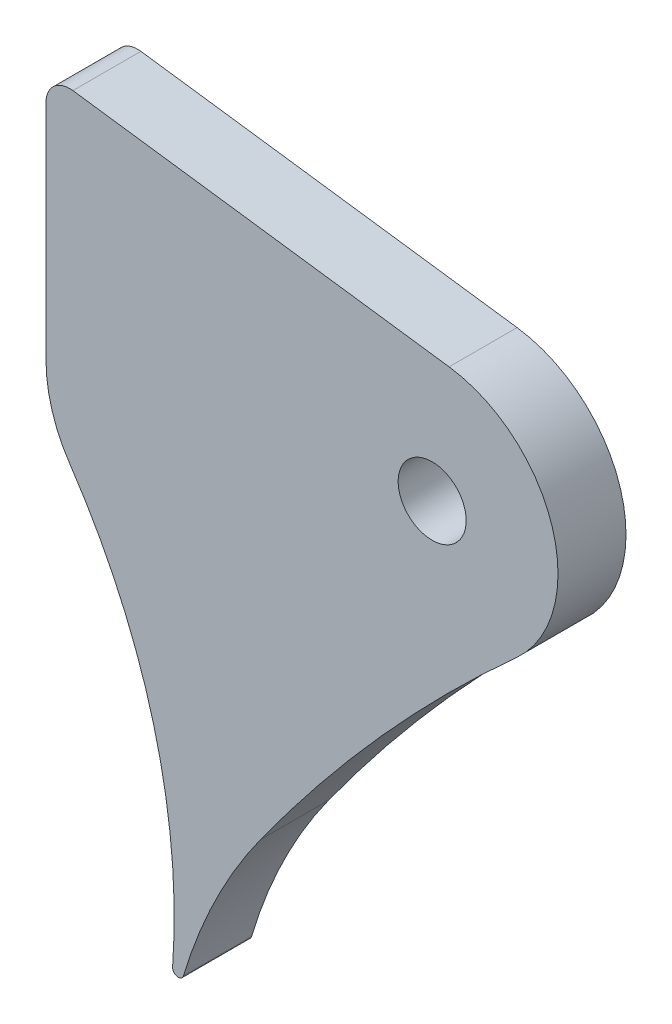
ISO-10303-21;
HEADER;
FILE_DESCRIPTION(('STEP AP214'),'2;1');
FILE_NAME('part.step','',(''),(''),'','','');
FILE_SCHEMA(('AUTOMOTIVE_DESIGN { 1 0 10303 214 1 1 1 1 }'));
ENDSEC;
DATA;
#1=APPLICATION_CONTEXT('core data for automotive mechanical design processes');
#2=APPLICATION_PROTOCOL_DEFINITION('international standard','automotive_design',2000,#1);
#3=PRODUCT_CONTEXT('',#1,'mechanical');
#4=PRODUCT('Part','Part','',(#3));
#5=PRODUCT_RELATED_PRODUCT_CATEGORY('part','',(#4));
#6=PRODUCT_DEFINITION_FORMATION('','',#4);
#7=PRODUCT_DEFINITION_CONTEXT('part definition',#1,'design');
#8=PRODUCT_DEFINITION('design','',#6,#7);
#9=PRODUCT_DEFINITION_SHAPE('','',#8);
#10=(LENGTH_UNIT() NAMED_UNIT(*) SI_UNIT(.MILLI.,.METRE.));
#11=(NAMED_UNIT(*) PLANE_ANGLE_UNIT() SI_UNIT($,.RADIAN.));
#12=(NAMED_UNIT(*) SI_UNIT($,.STERADIAN.) SOLID_ANGLE_UNIT());
#13=UNCERTAINTY_MEASURE_WITH_UNIT(LENGTH_MEASURE(1.E-05),#10,'distance_accuracy_value','');
#14=(GEOMETRIC_REPRESENTATION_CONTEXT(3) GLOBAL_UNCERTAINTY_ASSIGNED_CONTEXT((#13)) GLOBAL_UNIT_ASSIGNED_CONTEXT((#10,
#11,#12)) REPRESENTATION_CONTEXT('',''));
#15=CARTESIAN_POINT('',(0.,0.,0.));
#16=DIRECTION('',(0.,0.,1.));
#17=DIRECTION('',(1.,0.,0.));
#18=AXIS2_PLACEMENT_3D('',#15,#16,#17);
#19=CARTESIAN_POINT('',(-0.743160136818629,10.4484131177492,1.));
#20=DIRECTION('',(0.,0.,-1.));
#21=DIRECTION('',(-1.,0.,0.));
#22=AXIS2_PLACEMENT_3D('',#19,#20,#21);
#23=CYLINDRICAL_SURFACE('',#22,0.348328845066206);
#24=CARTESIAN_POINT('',(-0.743160136818629,10.4484131177492,0.));
#25=DIRECTION('',(0.,0.,1.));
#26=DIRECTION('',(1.,0.,0.));
#27=AXIS2_PLACEMENT_3D('',#24,#25,#26);
#28=CIRCLE('',#27,0.348328845066206);
#29=CARTESIAN_POINT('',(-0.696246030630978,10.7935682291785,0.));
#30=VERTEX_POINT('',#29);
#31=CARTESIAN_POINT('',(-1.09148898188484,10.4484131177492,0.));
#32=VERTEX_POINT('',#31);
#33=EDGE_CURVE('E139',#30,#32,#28,.T.);
#34=ORIENTED_EDGE('',*,*,#33,.T.);
#35=DIRECTION('',(0.,0.,-1.));
#36=VECTOR('',#35,1.);
#37=CARTESIAN_POINT('',(-1.09148898188484,10.4484131177492,1.));
#38=LINE('',#37,#36);
#39=CARTESIAN_POINT('',(-1.09148898188484,10.4484131177492,1.));
#40=VERTEX_POINT('',#39);
#41=EDGE_CURVE('E41',#40,#32,#38,.T.);
#42=ORIENTED_EDGE('',*,*,#41,.F.);
#43=CARTESIAN_POINT('',(-0.743160136818629,10.4484131177492,1.));
#44=DIRECTION('',(0.,0.,1.));
#45=DIRECTION('',(1.,0.,0.));
#46=AXIS2_PLACEMENT_3D('',#43,#44,#45);
#47=CIRCLE('',#46,0.348328845066206);
#48=CARTESIAN_POINT('',(-0.696246030630978,10.7935682291785,1.));
#49=VERTEX_POINT('',#48);
#50=EDGE_CURVE('E96',#49,#40,#47,.T.);
#51=ORIENTED_EDGE('',*,*,#50,.F.);
#52=DIRECTION('',(0.,0.,-1.));
#53=VECTOR('',#52,1.);
#54=CARTESIAN_POINT('',(-0.696246030630978,10.7935682291785,1.));
#55=LINE('',#54,#53);
#56=EDGE_CURVE('E11',#49,#30,#55,.T.);
#57=ORIENTED_EDGE('',*,*,#56,.T.);
#58=EDGE_LOOP('',(#34,#42,#51,#57));
#59=FACE_BOUND('',#58,.T.);
#60=ADVANCED_FACE('F33',(#59),#23,.T.);
#61=CARTESIAN_POINT('',(-1.09148898188484,10.4484131177492,1.));
#62=DIRECTION('',(1.,0.,0.));
#63=DIRECTION('',(0.,0.,-1.));
#64=AXIS2_PLACEMENT_3D('',#61,#62,#63);
#65=PLANE('',#64);
#66=DIRECTION('',(0.,-1.,0.));
#67=VECTOR('',#66,1.);
#68=CARTESIAN_POINT('',(-1.09148898188484,10.4484131177492,0.));
#69=LINE('',#68,#67);
#70=CARTESIAN_POINT('',(-1.09148898188484,7.16252429092442,0.));
#71=VERTEX_POINT('',#70);
#72=EDGE_CURVE('E141',#32,#71,#69,.T.);
#73=ORIENTED_EDGE('',*,*,#72,.T.);
#74=DIRECTION('',(0.,0.,-1.));
#75=VECTOR('',#74,1.);
#76=CARTESIAN_POINT('',(-1.09148898188484,7.16252429092442,1.));
#77=LINE('',#76,#75);
#78=CARTESIAN_POINT('',(-1.09148898188484,7.16252429092442,1.));
#79=VERTEX_POINT('',#78);
#80=EDGE_CURVE('E164',#79,#71,#77,.T.);
#81=ORIENTED_EDGE('',*,*,#80,.F.);
#82=DIRECTION('',(0.,-1.,0.));
#83=VECTOR('',#82,1.);
#84=CARTESIAN_POINT('',(-1.09148898188484,10.4484131177492,1.));
#85=LINE('',#84,#83);
#86=EDGE_CURVE('E172',#40,#79,#85,.T.);
#87=ORIENTED_EDGE('',*,*,#86,.F.);
#88=ORIENTED_EDGE('',*,*,#41,.T.);
#89=EDGE_LOOP('',(#73,#81,#87,#88));
#90=FACE_BOUND('',#89,.T.);
#91=ADVANCED_FACE('F170',(#90),#65,.F.);
#92=CARTESIAN_POINT('',(0.959123240132854,7.16252429092442,1.));
#93=DIRECTION('',(0.,0.,-1.));
#94=DIRECTION('',(-1.,0.,0.));
#95=AXIS2_PLACEMENT_3D('',#92,#93,#94);
#96=CYLINDRICAL_SURFACE('',#95,2.05061222201769);
#97=CARTESIAN_POINT('',(0.959123240132854,7.16252429092442,0.));
#98=DIRECTION('',(0.,0.,1.));
#99=DIRECTION('',(1.,0.,0.));
#100=AXIS2_PLACEMENT_3D('',#97,#98,#99);
#101=CIRCLE('',#100,2.05061222201769);
#102=CARTESIAN_POINT('',(-0.73936189724489,6.01354268828875,0.));
#103=VERTEX_POINT('',#102);
#104=EDGE_CURVE('E144',#71,#103,#101,.T.);
#105=ORIENTED_EDGE('',*,*,#104,.T.);
#106=DIRECTION('',(0.,0.,-1.));
#107=VECTOR('',#106,1.);
#108=CARTESIAN_POINT('',(-0.73936189724489,6.01354268828875,1.));
#109=LINE('',#108,#107);
#110=CARTESIAN_POINT('',(-0.73936189724489,6.01354268828875,1.));
#111=VERTEX_POINT('',#110);
#112=EDGE_CURVE('E161',#111,#103,#109,.T.);
#113=ORIENTED_EDGE('',*,*,#112,.F.);
#114=CARTESIAN_POINT('',(0.959123240132854,7.16252429092442,1.));
#115=DIRECTION('',(0.,0.,1.));
#116=DIRECTION('',(1.,0.,0.));
#117=AXIS2_PLACEMENT_3D('',#114,#115,#116);
#118=CIRCLE('',#117,2.05061222201769);
#119=EDGE_CURVE('E189',#79,#111,#118,.T.);
#120=ORIENTED_EDGE('',*,*,#119,.F.);
#121=ORIENTED_EDGE('',*,*,#80,.T.);
#122=EDGE_LOOP('',(#105,#113,#120,#121));
#123=FACE_BOUND('',#122,.T.);
#124=ADVANCED_FACE('F182',(#123),#96,.T.);
#125=CARTESIAN_POINT('',(-8.13590877208619,1.00996856496988,1.));
#126=DIRECTION('',(0.,0.,-1.));
#127=DIRECTION('',(-1.,0.,0.));
#128=AXIS2_PLACEMENT_3D('',#125,#126,#127);
#129=CYLINDRICAL_SURFACE('',#128,8.92998654418196);
#130=CARTESIAN_POINT('',(-8.13590877208619,1.00996856496988,0.));
#131=DIRECTION('',(0.,0.,-1.));
#132=DIRECTION('',(-1.,0.,0.));
#133=AXIS2_PLACEMENT_3D('',#130,#131,#132);
#134=CIRCLE('',#133,8.92998654418196);
#135=CARTESIAN_POINT('',(0.770614998302804,0.363057437560029,0.));
#136=VERTEX_POINT('',#135);
#137=EDGE_CURVE('E146',#103,#136,#134,.T.);
#138=ORIENTED_EDGE('',*,*,#137,.T.);
#139=DIRECTION('',(0.,0.,-1.));
#140=VECTOR('',#139,1.);
#141=CARTESIAN_POINT('',(0.770614998302804,0.363057437560029,1.));
#142=LINE('',#141,#140);
#143=CARTESIAN_POINT('',(0.770614998302804,0.363057437560029,1.));
#144=VERTEX_POINT('',#143);
#145=EDGE_CURVE('E158',#144,#136,#142,.T.);
#146=ORIENTED_EDGE('',*,*,#145,.F.);
#147=CARTESIAN_POINT('',(-8.13590877208619,1.00996856496988,1.));
#148=DIRECTION('',(0.,0.,-1.));
#149=DIRECTION('',(-1.,0.,0.));
#150=AXIS2_PLACEMENT_3D('',#147,#148,#149);
#151=CIRCLE('',#150,8.92998654418196);
#152=EDGE_CURVE('E188',#111,#144,#151,.T.);
#153=ORIENTED_EDGE('',*,*,#152,.F.);
#154=ORIENTED_EDGE('',*,*,#112,.T.);
#155=EDGE_LOOP('',(#138,#146,#153,#154));
#156=FACE_BOUND('',#155,.T.);
#157=ADVANCED_FACE('F186',(#156),#129,.F.);
#158=CARTESIAN_POINT('',(0.852333247185135,0.357121963083423,1.));
#159=DIRECTION('',(0.,0.,-1.));
#160=DIRECTION('',(-1.,0.,0.));
#161=AXIS2_PLACEMENT_3D('',#158,#159,#160);
#162=CYLINDRICAL_SURFACE('',#161,0.0819335221851055);
#163=CARTESIAN_POINT('',(0.852333247185135,0.357121963083423,0.));
#164=DIRECTION('',(0.,0.,1.));
#165=DIRECTION('',(1.,0.,0.));
#166=AXIS2_PLACEMENT_3D('',#163,#164,#165);
#167=CIRCLE('',#166,0.0819335221851055);
#168=CARTESIAN_POINT('',(0.930843558597216,0.333686241211994,0.));
#169=VERTEX_POINT('',#168);
#170=EDGE_CURVE('E148',#136,#169,#167,.T.);
#171=ORIENTED_EDGE('',*,*,#170,.T.);
#172=DIRECTION('',(0.,0.,-1.));
#173=VECTOR('',#172,1.);
#174=CARTESIAN_POINT('',(0.930843558597216,0.333686241211994,1.));
#175=LINE('',#174,#173);
#176=CARTESIAN_POINT('',(0.930843558597216,0.333686241211994,1.));
#177=VERTEX_POINT('',#176);
#178=EDGE_CURVE('E128',#177,#169,#175,.T.);
#179=ORIENTED_EDGE('',*,*,#178,.F.);
#180=CARTESIAN_POINT('',(0.852333247185135,0.357121963083423,1.));
#181=DIRECTION('',(0.,0.,1.));
#182=DIRECTION('',(1.,0.,0.));
#183=AXIS2_PLACEMENT_3D('',#180,#181,#182);
#184=CIRCLE('',#183,0.0819335221851055);
#185=EDGE_CURVE('E119',#144,#177,#184,.T.);
#186=ORIENTED_EDGE('',*,*,#185,.F.);
#187=ORIENTED_EDGE('',*,*,#145,.T.);
#188=EDGE_LOOP('',(#171,#179,#186,#187));
#189=FACE_BOUND('',#188,.T.);
#190=ADVANCED_FACE('F224',(#189),#162,.T.);
#191=CARTESIAN_POINT('',(8.30987457347198,-1.86899154002326,1.));
#192=DIRECTION('',(0.,0.,-1.));
#193=DIRECTION('',(-1.,0.,0.));
#194=AXIS2_PLACEMENT_3D('',#191,#192,#193);
#195=CYLINDRICAL_SURFACE('',#194,7.70077191756977);
#196=CARTESIAN_POINT('',(8.30987457347198,-1.86899154002326,0.));
#197=DIRECTION('',(0.,0.,-1.));
#198=DIRECTION('',(1.,0.,0.));
#199=AXIS2_PLACEMENT_3D('',#196,#197,#198);
#200=CIRCLE('',#199,7.70077191756977);
#201=CARTESIAN_POINT('',(2.06219570544476,2.63305209464282,0.));
#202=VERTEX_POINT('',#201);
#203=EDGE_CURVE('E127',#169,#202,#200,.T.);
#204=ORIENTED_EDGE('',*,*,#203,.T.);
#205=DIRECTION('',(0.,0.,-1.));
#206=VECTOR('',#205,1.);
#207=CARTESIAN_POINT('',(2.06219570544476,2.63305209464282,1.));
#208=LINE('',#207,#206);
#209=CARTESIAN_POINT('',(2.06219570544476,2.63305209464282,1.));
#210=VERTEX_POINT('',#209);
#211=EDGE_CURVE('E124',#210,#202,#208,.T.);
#212=ORIENTED_EDGE('',*,*,#211,.F.);
#213=CARTESIAN_POINT('',(8.30987457347198,-1.86899154002326,1.));
#214=DIRECTION('',(0.,0.,-1.));
#215=DIRECTION('',(1.,0.,0.));
#216=AXIS2_PLACEMENT_3D('',#213,#214,#215);
#217=CIRCLE('',#216,7.70077191756977);
#218=EDGE_CURVE('E113',#177,#210,#217,.T.);
#219=ORIENTED_EDGE('',*,*,#218,.F.);
#220=ORIENTED_EDGE('',*,*,#178,.T.);
#221=EDGE_LOOP('',(#204,#212,#219,#220));
#222=FACE_BOUND('',#221,.T.);
#223=ADVANCED_FACE('F125',(#222),#195,.F.);
#224=CARTESIAN_POINT('',(23.6216119215303,-12.9025467402238,1.));
#225=DIRECTION('',(0.,0.,-1.));
#226=DIRECTION('',(-1.,0.,0.));
#227=AXIS2_PLACEMENT_3D('',#224,#225,#226);
#228=CYLINDRICAL_SURFACE('',#227,26.5737324953857);
#229=CARTESIAN_POINT('',(23.6216119215303,-12.9025467402238,0.));
#230=DIRECTION('',(0.,0.,-1.));
#231=DIRECTION('',(-1.,0.,0.));
#232=AXIS2_PLACEMENT_3D('',#229,#230,#231);
#233=CIRCLE('',#232,26.5737324953857);
#234=CARTESIAN_POINT('',(5.82676904648788,6.83338054452451,0.));
#235=VERTEX_POINT('',#234);
#236=EDGE_CURVE('E82',#202,#235,#233,.T.);
#237=ORIENTED_EDGE('',*,*,#236,.T.);
#238=DIRECTION('',(0.,0.,-1.));
#239=VECTOR('',#238,1.);
#240=CARTESIAN_POINT('',(5.82676904648788,6.83338054452451,1.));
#241=LINE('',#240,#239);
#242=CARTESIAN_POINT('',(5.82676904648788,6.83338054452451,1.));
#243=VERTEX_POINT('',#242);
#244=EDGE_CURVE('E129',#243,#235,#241,.T.);
#245=ORIENTED_EDGE('',*,*,#244,.F.);
#246=CARTESIAN_POINT('',(23.6216119215303,-12.9025467402238,1.));
#247=DIRECTION('',(0.,0.,-1.));
#248=DIRECTION('',(-1.,0.,0.));
#249=AXIS2_PLACEMENT_3D('',#246,#247,#248);
#250=CIRCLE('',#249,26.5737324953857);
#251=EDGE_CURVE('E117',#210,#243,#250,.T.);
#252=ORIENTED_EDGE('',*,*,#251,.F.);
#253=ORIENTED_EDGE('',*,*,#211,.T.);
#254=EDGE_LOOP('',(#237,#245,#252,#253));
#255=FACE_BOUND('',#254,.T.);
#256=ADVANCED_FACE('F131',(#255),#228,.F.);
#257=CARTESIAN_POINT('',(4.58754209046243,8.20778397506675,1.));
#258=DIRECTION('',(0.,0.,-1.));
#259=DIRECTION('',(-1.,0.,0.));
#260=AXIS2_PLACEMENT_3D('',#257,#258,#259);
#261=CYLINDRICAL_SURFACE('',#260,1.85058591760188);
#262=CARTESIAN_POINT('',(4.58754209046243,8.20778397506675,0.));
#263=DIRECTION('',(0.,0.,1.));
#264=DIRECTION('',(-1.,0.,0.));
#265=AXIS2_PLACEMENT_3D('',#262,#263,#264);
#266=CIRCLE('',#265,1.85058591760188);
#267=CARTESIAN_POINT('',(4.83678525673321,10.0415086224699,0.));
#268=VERTEX_POINT('',#267);
#269=EDGE_CURVE('E89',#235,#268,#266,.T.);
#270=ORIENTED_EDGE('',*,*,#269,.T.);
#271=DIRECTION('',(0.,0.,-1.));
#272=VECTOR('',#271,1.);
#273=CARTESIAN_POINT('',(4.83678525673321,10.0415086224699,1.));
#274=LINE('',#273,#272);
#275=CARTESIAN_POINT('',(4.83678525673321,10.0415086224699,1.));
#276=VERTEX_POINT('',#275);
#277=EDGE_CURVE('E135',#276,#268,#274,.T.);
#278=ORIENTED_EDGE('',*,*,#277,.F.);
#279=CARTESIAN_POINT('',(4.58754209046243,8.20778397506675,1.));
#280=DIRECTION('',(0.,0.,1.));
#281=DIRECTION('',(-1.,0.,0.));
#282=AXIS2_PLACEMENT_3D('',#279,#280,#281);
#283=CIRCLE('',#282,1.85058591760188);
#284=EDGE_CURVE('E133',#243,#276,#283,.T.);
#285=ORIENTED_EDGE('',*,*,#284,.F.);
#286=ORIENTED_EDGE('',*,*,#244,.T.);
#287=EDGE_LOOP('',(#270,#278,#285,#286));
#288=FACE_BOUND('',#287,.T.);
#289=ADVANCED_FACE('F217',(#288),#261,.T.);
#290=CARTESIAN_POINT('',(0.566665574765927,10.6219110026178,1.));
#291=DIRECTION('',(-0.134683379950159,-0.990888685557162,0.));
#292=DIRECTION('',(0.990888685557163,-0.134683379950159,0.));
#293=AXIS2_PLACEMENT_3D('',#290,#291,#292);
#294=PLANE('',#293);
#295=DIRECTION('',(-0.990888685557162,0.134683379950159,0.));
#296=VECTOR('',#295,1.);
#297=CARTESIAN_POINT('',(0.566665574765927,10.6219110026178,0.));
#298=LINE('',#297,#296);
#299=EDGE_CURVE('E153',#268,#30,#298,.T.);
#300=ORIENTED_EDGE('',*,*,#299,.T.);
#301=ORIENTED_EDGE('',*,*,#56,.F.);
#302=DIRECTION('',(-0.990888685557162,0.134683379950159,0.));
#303=VECTOR('',#302,1.);
#304=CARTESIAN_POINT('',(0.566665574765927,10.6219110026178,1.));
#305=LINE('',#304,#303);
#306=EDGE_CURVE('E49',#276,#49,#305,.T.);
#307=ORIENTED_EDGE('',*,*,#306,.F.);
#308=ORIENTED_EDGE('',*,*,#277,.T.);
#309=EDGE_LOOP('',(#300,#301,#307,#308));
#310=FACE_BOUND('',#309,.T.);
#311=ADVANCED_FACE('F210',(#310),#294,.F.);
#312=CARTESIAN_POINT('',(-0.743160136818629,10.4484131177492,1.));
#313=DIRECTION('',(0.,0.,1.));
#314=DIRECTION('',(1.,0.,0.));
#315=AXIS2_PLACEMENT_3D('',#312,#313,#314);
#316=PLANE('',#315);
#317=CARTESIAN_POINT('',(4.58754209046243,8.20778397506675,1.));
#318=DIRECTION('',(0.,0.,1.));
#319=DIRECTION('',(1.,0.,0.));
#320=AXIS2_PLACEMENT_3D('',#317,#318,#319);
#321=CIRCLE('',#320,0.500000000000001);
#322=CARTESIAN_POINT('',(5.08754209046243,8.20778397506675,1.));
#323=VERTEX_POINT('',#322);
#324=EDGE_CURVE('E196',#323,#323,#321,.T.);
#325=ORIENTED_EDGE('',*,*,#324,.F.);
#326=EDGE_LOOP('',(#325));
#327=FACE_BOUND('',#326,.T.);
#328=ORIENTED_EDGE('',*,*,#306,.T.);
#329=ORIENTED_EDGE('',*,*,#50,.T.);
#330=ORIENTED_EDGE('',*,*,#86,.T.);
#331=ORIENTED_EDGE('',*,*,#119,.T.);
#332=ORIENTED_EDGE('',*,*,#152,.T.);
#333=ORIENTED_EDGE('',*,*,#185,.T.);
#334=ORIENTED_EDGE('',*,*,#218,.T.);
#335=ORIENTED_EDGE('',*,*,#251,.T.);
#336=ORIENTED_EDGE('',*,*,#284,.T.);
#337=EDGE_LOOP('',(#328,#329,#330,#331,#332,#333,#334,#335,#336));
#338=FACE_BOUND('',#337,.T.);
#339=ADVANCED_FACE('F115',(#327,#338),#316,.T.);
#340=CARTESIAN_POINT('',(-0.743160136818629,10.4484131177492,0.));
#341=DIRECTION('',(0.,0.,1.));
#342=DIRECTION('',(1.,0.,0.));
#343=AXIS2_PLACEMENT_3D('',#340,#341,#342);
#344=PLANE('',#343);
#345=CARTESIAN_POINT('',(4.58754209046243,8.20778397506675,0.));
#346=DIRECTION('',(0.,0.,1.));
#347=DIRECTION('',(1.,0.,0.));
#348=AXIS2_PLACEMENT_3D('',#345,#346,#347);
#349=CIRCLE('',#348,0.500000000000001);
#350=CARTESIAN_POINT('',(5.08754209046243,8.20778397506675,0.));
#351=VERTEX_POINT('',#350);
#352=EDGE_CURVE('E142',#351,#351,#349,.T.);
#353=ORIENTED_EDGE('',*,*,#352,.T.);
#354=EDGE_LOOP('',(#353));
#355=FACE_BOUND('',#354,.T.);
#356=ORIENTED_EDGE('',*,*,#33,.F.);
#357=ORIENTED_EDGE('',*,*,#299,.F.);
#358=ORIENTED_EDGE('',*,*,#269,.F.);
#359=ORIENTED_EDGE('',*,*,#236,.F.);
#360=ORIENTED_EDGE('',*,*,#203,.F.);
#361=ORIENTED_EDGE('',*,*,#170,.F.);
#362=ORIENTED_EDGE('',*,*,#137,.F.);
#363=ORIENTED_EDGE('',*,*,#104,.F.);
#364=ORIENTED_EDGE('',*,*,#72,.F.);
#365=EDGE_LOOP('',(#356,#357,#358,#359,#360,#361,#362,#363,#364));
#366=FACE_BOUND('',#365,.T.);
#367=ADVANCED_FACE('F176',(#355,#366),#344,.F.);
#368=CARTESIAN_POINT('',(4.58754209046243,8.20778397506675,0.));
#369=DIRECTION('',(0.,0.,1.));
#370=DIRECTION('',(1.,0.,0.));
#371=AXIS2_PLACEMENT_3D('',#368,#369,#370);
#372=CYLINDRICAL_SURFACE('',#371,0.500000000000001);
#373=ORIENTED_EDGE('',*,*,#352,.F.);
#374=EDGE_LOOP('',(#373));
#375=FACE_BOUND('',#374,.T.);
#376=ORIENTED_EDGE('',*,*,#324,.T.);
#377=EDGE_LOOP('',(#376));
#378=FACE_BOUND('',#377,.T.);
#379=ADVANCED_FACE('F203',(#375,#378),#372,.F.);
#380=CLOSED_SHELL('',(#60,#91,#124,#157,#190,#223,#256,#289,#311,#339,#367,#379));
#381=MANIFOLD_SOLID_BREP('B2',#380);
#382=ADVANCED_BREP_SHAPE_REPRESENTATION('',(#18,#381),#14);
#383=SHAPE_DEFINITION_REPRESENTATION(#9,#382);
ENDSEC;
END-ISO-10303-21;
